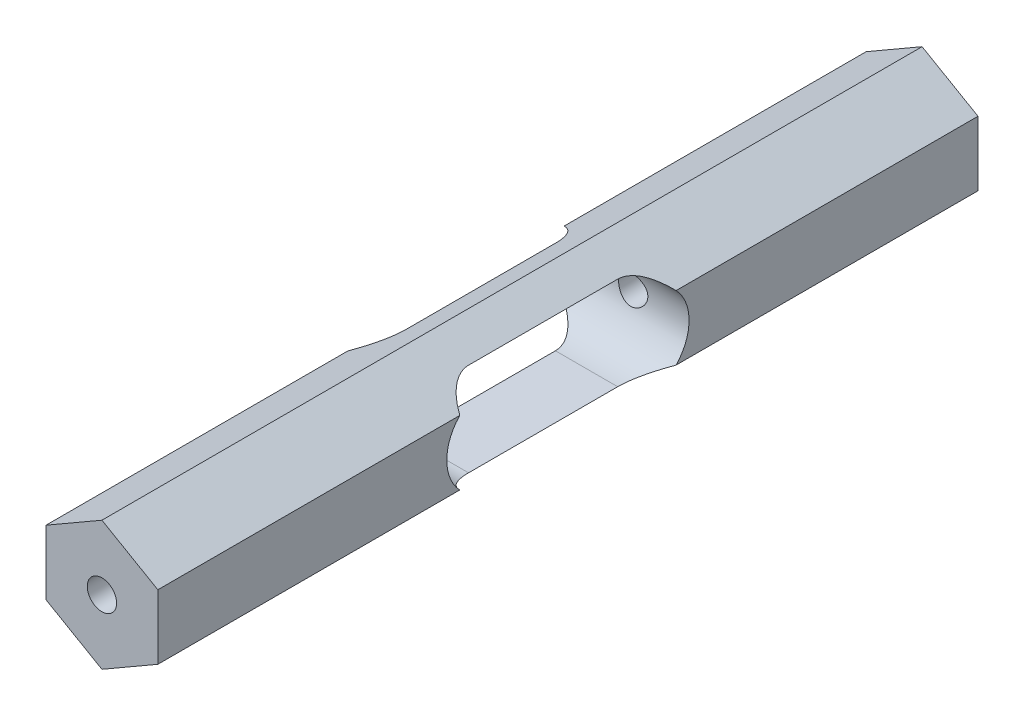
ISO-10303-21;
HEADER;
FILE_DESCRIPTION(('STEP AP214'),'2;1');
FILE_NAME('part.step','',(''),(''),'','','');
FILE_SCHEMA(('AUTOMOTIVE_DESIGN { 1 0 10303 214 1 1 1 1 }'));
ENDSEC;
DATA;
#1=APPLICATION_CONTEXT('core data for automotive mechanical design processes');
#2=APPLICATION_PROTOCOL_DEFINITION('international standard','automotive_design',2000,#1);
#3=PRODUCT_CONTEXT('',#1,'mechanical');
#4=PRODUCT('Part','Part','',(#3));
#5=PRODUCT_RELATED_PRODUCT_CATEGORY('part','',(#4));
#6=PRODUCT_DEFINITION_FORMATION('','',#4);
#7=PRODUCT_DEFINITION_CONTEXT('part definition',#1,'design');
#8=PRODUCT_DEFINITION('design','',#6,#7);
#9=PRODUCT_DEFINITION_SHAPE('','',#8);
#10=(LENGTH_UNIT() NAMED_UNIT(*) SI_UNIT(.MILLI.,.METRE.));
#11=(NAMED_UNIT(*) PLANE_ANGLE_UNIT() SI_UNIT($,.RADIAN.));
#12=(NAMED_UNIT(*) SI_UNIT($,.STERADIAN.) SOLID_ANGLE_UNIT());
#13=UNCERTAINTY_MEASURE_WITH_UNIT(LENGTH_MEASURE(1.E-05),#10,'distance_accuracy_value','');
#14=(GEOMETRIC_REPRESENTATION_CONTEXT(3) GLOBAL_UNCERTAINTY_ASSIGNED_CONTEXT((#13)) GLOBAL_UNIT_ASSIGNED_CONTEXT((#10,
#11,#12)) REPRESENTATION_CONTEXT('',''));
#15=CARTESIAN_POINT('',(0.,0.,0.));
#16=DIRECTION('',(0.,0.,1.));
#17=DIRECTION('',(1.,0.,0.));
#18=AXIS2_PLACEMENT_3D('',#15,#16,#17);
#19=CARTESIAN_POINT('',(-4.7625,2.74963065701559,34.925));
#20=DIRECTION('',(1.,0.,0.));
#21=DIRECTION('',(0.,1.,0.));
#22=AXIS2_PLACEMENT_3D('',#19,#20,#21);
#23=PLANE('',#22);
#24=DIRECTION('',(0.,0.,-1.));
#25=VECTOR('',#24,1.);
#26=CARTESIAN_POINT('',(-4.7625,2.74963065701559,34.925));
#27=LINE('',#26,#25);
#28=CARTESIAN_POINT('',(-4.7625,2.74963065701559,34.925));
#29=VERTEX_POINT('',#28);
#30=CARTESIAN_POINT('',(-4.7625,2.74963065701559,9.21190632489954));
#31=VERTEX_POINT('',#30);
#32=EDGE_CURVE('E229',#29,#31,#27,.T.);
#33=ORIENTED_EDGE('',*,*,#32,.T.);
#34=CARTESIAN_POINT('',(-4.7625,0.,6.35));
#35=DIRECTION('',(1.,0.,0.));
#36=DIRECTION('',(0.,0.,-1.));
#37=AXIS2_PLACEMENT_3D('',#34,#35,#36);
#38=CIRCLE('',#37,3.96875);
#39=CARTESIAN_POINT('',(-4.7625,-2.74963065701559,9.21190632489954));
#40=VERTEX_POINT('',#39);
#41=EDGE_CURVE('E256',#31,#40,#38,.T.);
#42=ORIENTED_EDGE('',*,*,#41,.T.);
#43=DIRECTION('',(0.,0.,-1.));
#44=VECTOR('',#43,1.);
#45=CARTESIAN_POINT('',(-4.7625,-2.74963065701559,34.925));
#46=LINE('',#45,#44);
#47=CARTESIAN_POINT('',(-4.7625,-2.74963065701559,34.925));
#48=VERTEX_POINT('',#47);
#49=EDGE_CURVE('E226',#48,#40,#46,.T.);
#50=ORIENTED_EDGE('',*,*,#49,.F.);
#51=DIRECTION('',(0.,-1.,0.));
#52=VECTOR('',#51,1.);
#53=CARTESIAN_POINT('',(-4.7625,2.74963065701559,34.925));
#54=LINE('',#53,#52);
#55=EDGE_CURVE('E192',#29,#48,#54,.T.);
#56=ORIENTED_EDGE('',*,*,#55,.F.);
#57=EDGE_LOOP('',(#33,#42,#50,#56));
#58=FACE_BOUND('',#57,.T.);
#59=ADVANCED_FACE('F37',(#58),#23,.F.);
#60=CARTESIAN_POINT('',(4.7625,-2.74963065701559,34.925));
#61=DIRECTION('',(-1.,0.,0.));
#62=DIRECTION('',(0.,-1.,0.));
#63=AXIS2_PLACEMENT_3D('',#60,#61,#62);
#64=PLANE('',#63);
#65=DIRECTION('',(0.,0.,-1.));
#66=VECTOR('',#65,1.);
#67=CARTESIAN_POINT('',(4.7625,-2.74963065701559,34.925));
#68=LINE('',#67,#66);
#69=CARTESIAN_POINT('',(4.7625,-2.74963065701559,34.925));
#70=VERTEX_POINT('',#69);
#71=CARTESIAN_POINT('',(4.7625,-2.74963065701559,9.21190632489954));
#72=VERTEX_POINT('',#71);
#73=EDGE_CURVE('E219',#70,#72,#68,.T.);
#74=ORIENTED_EDGE('',*,*,#73,.T.);
#75=CARTESIAN_POINT('',(4.7625,0.,6.35));
#76=DIRECTION('',(-1.,0.,0.));
#77=DIRECTION('',(0.,-1.,0.));
#78=AXIS2_PLACEMENT_3D('',#75,#76,#77);
#79=CIRCLE('',#78,3.96875);
#80=CARTESIAN_POINT('',(4.7625,2.74963065701559,9.21190632489954));
#81=VERTEX_POINT('',#80);
#82=EDGE_CURVE('E237',#72,#81,#79,.T.);
#83=ORIENTED_EDGE('',*,*,#82,.T.);
#84=DIRECTION('',(0.,0.,-1.));
#85=VECTOR('',#84,1.);
#86=CARTESIAN_POINT('',(4.7625,2.74963065701559,34.925));
#87=LINE('',#86,#85);
#88=CARTESIAN_POINT('',(4.7625,2.74963065701559,34.925));
#89=VERTEX_POINT('',#88);
#90=EDGE_CURVE('E215',#89,#81,#87,.T.);
#91=ORIENTED_EDGE('',*,*,#90,.F.);
#92=DIRECTION('',(0.,1.,0.));
#93=VECTOR('',#92,1.);
#94=CARTESIAN_POINT('',(4.7625,-2.74963065701559,34.925));
#95=LINE('',#94,#93);
#96=EDGE_CURVE('E198',#70,#89,#95,.T.);
#97=ORIENTED_EDGE('',*,*,#96,.F.);
#98=EDGE_LOOP('',(#74,#83,#91,#97));
#99=FACE_BOUND('',#98,.T.);
#100=ADVANCED_FACE('F289',(#99),#64,.F.);
#101=CARTESIAN_POINT('',(4.7625,2.74963065701559,34.925));
#102=DIRECTION('',(-0.5,-0.866025403784439,0.));
#103=DIRECTION('',(0.866025403784439,-0.5,0.));
#104=AXIS2_PLACEMENT_3D('',#101,#102,#103);
#105=PLANE('',#104);
#106=ORIENTED_EDGE('',*,*,#90,.T.);
#107=CARTESIAN_POINT('',(9.525,0.,6.35));
#108=DIRECTION('',(-0.5,-0.866025403784439,0.));
#109=DIRECTION('',(0.866025403784439,-0.5,0.));
#110=AXIS2_PLACEMENT_3D('',#107,#108,#109);
#111=ELLIPSE('',#110,7.9375,3.96875);
#112=CARTESIAN_POINT('',(2.65092335746101,3.96875,6.35));
#113=VERTEX_POINT('',#112);
#114=EDGE_CURVE('E177',#81,#113,#111,.T.);
#115=ORIENTED_EDGE('',*,*,#114,.T.);
#116=DIRECTION('',(0.,0.,-1.));
#117=VECTOR('',#116,1.);
#118=CARTESIAN_POINT('',(2.65092335746102,3.96875,34.925));
#119=LINE('',#118,#117);
#120=CARTESIAN_POINT('',(2.65092335746101,3.96875,-6.35));
#121=VERTEX_POINT('',#120);
#122=EDGE_CURVE('E183',#113,#121,#119,.T.);
#123=ORIENTED_EDGE('',*,*,#122,.T.);
#124=CARTESIAN_POINT('',(9.525,0.,-6.35));
#125=DIRECTION('',(-0.5,-0.866025403784439,0.));
#126=DIRECTION('',(0.866025403784439,-0.5,0.));
#127=AXIS2_PLACEMENT_3D('',#124,#125,#126);
#128=ELLIPSE('',#127,7.9375,3.96875);
#129=CARTESIAN_POINT('',(4.7625,2.74963065701559,-9.21190632489954));
#130=VERTEX_POINT('',#129);
#131=EDGE_CURVE('E156',#121,#130,#128,.T.);
#132=ORIENTED_EDGE('',*,*,#131,.T.);
#133=CARTESIAN_POINT('',(4.7625,2.74963065701559,-34.925));
#134=VERTEX_POINT('',#133);
#135=EDGE_CURVE('E200',#130,#134,#87,.T.);
#136=ORIENTED_EDGE('',*,*,#135,.T.);
#137=DIRECTION('',(-0.866025403784439,0.5,0.));
#138=VECTOR('',#137,1.);
#139=CARTESIAN_POINT('',(4.7625,2.74963065701559,-34.925));
#140=LINE('',#139,#138);
#141=CARTESIAN_POINT('',(0.,5.49926131403118,-34.925));
#142=VERTEX_POINT('',#141);
#143=EDGE_CURVE('E185',#134,#142,#140,.T.);
#144=ORIENTED_EDGE('',*,*,#143,.T.);
#145=DIRECTION('',(0.,0.,-1.));
#146=VECTOR('',#145,1.);
#147=CARTESIAN_POINT('',(0.,5.49926131403118,34.925));
#148=LINE('',#147,#146);
#149=CARTESIAN_POINT('',(0.,5.49926131403118,34.925));
#150=VERTEX_POINT('',#149);
#151=EDGE_CURVE('E232',#150,#142,#148,.T.);
#152=ORIENTED_EDGE('',*,*,#151,.F.);
#153=DIRECTION('',(-0.866025403784439,0.5,0.));
#154=VECTOR('',#153,1.);
#155=CARTESIAN_POINT('',(4.7625,2.74963065701559,34.925));
#156=LINE('',#155,#154);
#157=EDGE_CURVE('E186',#89,#150,#156,.T.);
#158=ORIENTED_EDGE('',*,*,#157,.F.);
#159=EDGE_LOOP('',(#106,#115,#123,#132,#136,#144,#152,#158));
#160=FACE_BOUND('',#159,.T.);
#161=ADVANCED_FACE('F39',(#160),#105,.F.);
#162=CARTESIAN_POINT('',(0.,5.49926131403118,34.925));
#163=DIRECTION('',(0.5,-0.866025403784439,0.));
#164=DIRECTION('',(0.866025403784439,0.5,0.));
#165=AXIS2_PLACEMENT_3D('',#162,#163,#164);
#166=PLANE('',#165);
#167=DIRECTION('',(0.,0.,1.));
#168=VECTOR('',#167,1.);
#169=CARTESIAN_POINT('',(-2.65092335746102,3.96875,34.925));
#170=LINE('',#169,#168);
#171=CARTESIAN_POINT('',(-2.65092335746102,3.96875,-6.35));
#172=VERTEX_POINT('',#171);
#173=CARTESIAN_POINT('',(-2.65092335746102,3.96875,6.35));
#174=VERTEX_POINT('',#173);
#175=EDGE_CURVE('E11',#172,#174,#170,.T.);
#176=ORIENTED_EDGE('',*,*,#175,.T.);
#177=CARTESIAN_POINT('',(-9.525,0.,6.35));
#178=DIRECTION('',(0.5,-0.866025403784439,0.));
#179=DIRECTION('',(0.866025403784439,0.5,0.));
#180=AXIS2_PLACEMENT_3D('',#177,#178,#179);
#181=ELLIPSE('',#180,7.9375,3.96875);
#182=EDGE_CURVE('E175',#174,#31,#181,.T.);
#183=ORIENTED_EDGE('',*,*,#182,.T.);
#184=ORIENTED_EDGE('',*,*,#32,.F.);
#185=DIRECTION('',(-0.866025403784439,-0.5,0.));
#186=VECTOR('',#185,1.);
#187=CARTESIAN_POINT('',(0.,5.49926131403118,34.925));
#188=LINE('',#187,#186);
#189=EDGE_CURVE('E189',#150,#29,#188,.T.);
#190=ORIENTED_EDGE('',*,*,#189,.F.);
#191=ORIENTED_EDGE('',*,*,#151,.T.);
#192=DIRECTION('',(-0.866025403784439,-0.5,0.));
#193=VECTOR('',#192,1.);
#194=CARTESIAN_POINT('',(0.,5.49926131403118,-34.925));
#195=LINE('',#194,#193);
#196=CARTESIAN_POINT('',(-4.7625,2.74963065701559,-34.925));
#197=VERTEX_POINT('',#196);
#198=EDGE_CURVE('E203',#142,#197,#195,.T.);
#199=ORIENTED_EDGE('',*,*,#198,.T.);
#200=CARTESIAN_POINT('',(-4.7625,2.74963065701559,-9.21190632489954));
#201=VERTEX_POINT('',#200);
#202=EDGE_CURVE('E161',#201,#197,#27,.T.);
#203=ORIENTED_EDGE('',*,*,#202,.F.);
#204=CARTESIAN_POINT('',(-9.525,0.,-6.35));
#205=DIRECTION('',(0.5,-0.866025403784439,0.));
#206=DIRECTION('',(0.866025403784439,0.5,0.));
#207=AXIS2_PLACEMENT_3D('',#204,#205,#206);
#208=ELLIPSE('',#207,7.9375,3.96875);
#209=EDGE_CURVE('E153',#201,#172,#208,.T.);
#210=ORIENTED_EDGE('',*,*,#209,.T.);
#211=EDGE_LOOP('',(#176,#183,#184,#190,#191,#199,#203,#210));
#212=FACE_BOUND('',#211,.T.);
#213=ADVANCED_FACE('F159',(#212),#166,.F.);
#214=CARTESIAN_POINT('',(-4.7625,-2.74963065701559,-9.21190632489954));
#215=VERTEX_POINT('',#214);
#216=CARTESIAN_POINT('',(-4.7625,-2.74963065701559,-34.925));
#217=VERTEX_POINT('',#216);
#218=EDGE_CURVE('E225',#215,#217,#46,.T.);
#219=ORIENTED_EDGE('',*,*,#218,.F.);
#220=CARTESIAN_POINT('',(-4.7625,0.,-6.35));
#221=DIRECTION('',(1.,0.,0.));
#222=DIRECTION('',(0.,0.,-1.));
#223=AXIS2_PLACEMENT_3D('',#220,#221,#222);
#224=CIRCLE('',#223,3.96875);
#225=EDGE_CURVE('E250',#215,#201,#224,.T.);
#226=ORIENTED_EDGE('',*,*,#225,.T.);
#227=ORIENTED_EDGE('',*,*,#202,.T.);
#228=DIRECTION('',(0.,-1.,0.));
#229=VECTOR('',#228,1.);
#230=CARTESIAN_POINT('',(-4.7625,2.74963065701559,-34.925));
#231=LINE('',#230,#229);
#232=EDGE_CURVE('E205',#197,#217,#231,.T.);
#233=ORIENTED_EDGE('',*,*,#232,.T.);
#234=EDGE_LOOP('',(#219,#226,#227,#233));
#235=FACE_BOUND('',#234,.T.);
#236=ADVANCED_FACE('F292',(#235),#23,.F.);
#237=CARTESIAN_POINT('',(-4.7625,-2.74963065701559,34.925));
#238=DIRECTION('',(0.5,0.866025403784439,0.));
#239=DIRECTION('',(-0.866025403784439,0.5,0.));
#240=AXIS2_PLACEMENT_3D('',#237,#238,#239);
#241=PLANE('',#240);
#242=ORIENTED_EDGE('',*,*,#49,.T.);
#243=CARTESIAN_POINT('',(-9.525,0.,6.35));
#244=DIRECTION('',(0.5,0.866025403784439,0.));
#245=DIRECTION('',(0.866025403784439,-0.5,0.));
#246=AXIS2_PLACEMENT_3D('',#243,#244,#245);
#247=ELLIPSE('',#246,7.93750000000001,3.96875);
#248=CARTESIAN_POINT('',(-2.65092335746102,-3.96875,6.35));
#249=VERTEX_POINT('',#248);
#250=EDGE_CURVE('E172',#40,#249,#247,.T.);
#251=ORIENTED_EDGE('',*,*,#250,.T.);
#252=DIRECTION('',(0.,0.,-1.));
#253=VECTOR('',#252,1.);
#254=CARTESIAN_POINT('',(-2.65092335746102,-3.96875,34.925));
#255=LINE('',#254,#253);
#256=CARTESIAN_POINT('',(-2.65092335746102,-3.96875,-6.34999999999999));
#257=VERTEX_POINT('',#256);
#258=EDGE_CURVE('E180',#249,#257,#255,.T.);
#259=ORIENTED_EDGE('',*,*,#258,.T.);
#260=CARTESIAN_POINT('',(-9.525,0.,-6.35));
#261=DIRECTION('',(0.5,0.866025403784439,0.));
#262=DIRECTION('',(0.866025403784439,-0.5,0.));
#263=AXIS2_PLACEMENT_3D('',#260,#261,#262);
#264=ELLIPSE('',#263,7.93750000000001,3.96875);
#265=EDGE_CURVE('E162',#257,#215,#264,.T.);
#266=ORIENTED_EDGE('',*,*,#265,.T.);
#267=ORIENTED_EDGE('',*,*,#218,.T.);
#268=DIRECTION('',(0.866025403784439,-0.5,0.));
#269=VECTOR('',#268,1.);
#270=CARTESIAN_POINT('',(-4.7625,-2.74963065701559,-34.925));
#271=LINE('',#270,#269);
#272=CARTESIAN_POINT('',(0.,-5.49926131403119,-34.925));
#273=VERTEX_POINT('',#272);
#274=EDGE_CURVE('E208',#217,#273,#271,.T.);
#275=ORIENTED_EDGE('',*,*,#274,.T.);
#276=DIRECTION('',(0.,0.,-1.));
#277=VECTOR('',#276,1.);
#278=CARTESIAN_POINT('',(0.,-5.49926131403119,34.925));
#279=LINE('',#278,#277);
#280=CARTESIAN_POINT('',(0.,-5.49926131403119,34.925));
#281=VERTEX_POINT('',#280);
#282=EDGE_CURVE('E222',#281,#273,#279,.T.);
#283=ORIENTED_EDGE('',*,*,#282,.F.);
#284=DIRECTION('',(0.866025403784439,-0.5,0.));
#285=VECTOR('',#284,1.);
#286=CARTESIAN_POINT('',(-4.7625,-2.74963065701559,34.925));
#287=LINE('',#286,#285);
#288=EDGE_CURVE('E194',#48,#281,#287,.T.);
#289=ORIENTED_EDGE('',*,*,#288,.F.);
#290=EDGE_LOOP('',(#242,#251,#259,#266,#267,#275,#283,#289));
#291=FACE_BOUND('',#290,.T.);
#292=ADVANCED_FACE('F301',(#291),#241,.F.);
#293=CARTESIAN_POINT('',(0.,-5.49926131403119,34.925));
#294=DIRECTION('',(-0.5,0.866025403784439,0.));
#295=DIRECTION('',(-0.866025403784438,-0.5,0.));
#296=AXIS2_PLACEMENT_3D('',#293,#294,#295);
#297=PLANE('',#296);
#298=DIRECTION('',(0.,0.,1.));
#299=VECTOR('',#298,1.);
#300=CARTESIAN_POINT('',(2.65092335746102,-3.96875,34.925));
#301=LINE('',#300,#299);
#302=CARTESIAN_POINT('',(2.65092335746102,-3.96875,-6.35));
#303=VERTEX_POINT('',#302);
#304=CARTESIAN_POINT('',(2.65092335746102,-3.96875,6.35));
#305=VERTEX_POINT('',#304);
#306=EDGE_CURVE('E50',#303,#305,#301,.T.);
#307=ORIENTED_EDGE('',*,*,#306,.T.);
#308=CARTESIAN_POINT('',(9.525,0.,6.35));
#309=DIRECTION('',(-0.5,0.866025403784439,0.));
#310=DIRECTION('',(0.866025403784438,0.5,0.));
#311=AXIS2_PLACEMENT_3D('',#308,#309,#310);
#312=ELLIPSE('',#311,7.9375,3.96875);
#313=EDGE_CURVE('E164',#305,#72,#312,.T.);
#314=ORIENTED_EDGE('',*,*,#313,.T.);
#315=ORIENTED_EDGE('',*,*,#73,.F.);
#316=DIRECTION('',(0.866025403784439,0.5,0.));
#317=VECTOR('',#316,1.);
#318=CARTESIAN_POINT('',(0.,-5.49926131403119,34.925));
#319=LINE('',#318,#317);
#320=EDGE_CURVE('E196',#281,#70,#319,.T.);
#321=ORIENTED_EDGE('',*,*,#320,.F.);
#322=ORIENTED_EDGE('',*,*,#282,.T.);
#323=DIRECTION('',(0.866025403784439,0.5,0.));
#324=VECTOR('',#323,1.);
#325=CARTESIAN_POINT('',(0.,-5.49926131403119,-34.925));
#326=LINE('',#325,#324);
#327=CARTESIAN_POINT('',(4.7625,-2.74963065701559,-34.925));
#328=VERTEX_POINT('',#327);
#329=EDGE_CURVE('E210',#273,#328,#326,.T.);
#330=ORIENTED_EDGE('',*,*,#329,.T.);
#331=CARTESIAN_POINT('',(4.7625,-2.74963065701559,-9.21190632489954));
#332=VERTEX_POINT('',#331);
#333=EDGE_CURVE('E218',#332,#328,#68,.T.);
#334=ORIENTED_EDGE('',*,*,#333,.F.);
#335=CARTESIAN_POINT('',(9.525,0.,-6.35));
#336=DIRECTION('',(-0.5,0.866025403784439,0.));
#337=DIRECTION('',(0.866025403784438,0.5,0.));
#338=AXIS2_PLACEMENT_3D('',#335,#336,#337);
#339=ELLIPSE('',#338,7.9375,3.96875);
#340=EDGE_CURVE('E64',#332,#303,#339,.T.);
#341=ORIENTED_EDGE('',*,*,#340,.T.);
#342=EDGE_LOOP('',(#307,#314,#315,#321,#322,#330,#334,#341));
#343=FACE_BOUND('',#342,.T.);
#344=ADVANCED_FACE('F242',(#343),#297,.F.);
#345=ORIENTED_EDGE('',*,*,#135,.F.);
#346=CARTESIAN_POINT('',(4.7625,0.,-6.35));
#347=DIRECTION('',(-1.,0.,0.));
#348=DIRECTION('',(0.,-1.,0.));
#349=AXIS2_PLACEMENT_3D('',#346,#347,#348);
#350=CIRCLE('',#349,3.96875);
#351=EDGE_CURVE('E235',#130,#332,#350,.T.);
#352=ORIENTED_EDGE('',*,*,#351,.T.);
#353=ORIENTED_EDGE('',*,*,#333,.T.);
#354=DIRECTION('',(0.,1.,0.));
#355=VECTOR('',#354,1.);
#356=CARTESIAN_POINT('',(4.7625,-2.74963065701559,-34.925));
#357=LINE('',#356,#355);
#358=EDGE_CURVE('E190',#328,#134,#357,.T.);
#359=ORIENTED_EDGE('',*,*,#358,.T.);
#360=EDGE_LOOP('',(#345,#352,#353,#359));
#361=FACE_BOUND('',#360,.T.);
#362=ADVANCED_FACE('F298',(#361),#64,.F.);
#363=CARTESIAN_POINT('',(0.,0.,34.925));
#364=DIRECTION('',(0.,0.,1.));
#365=DIRECTION('',(1.,0.,0.));
#366=AXIS2_PLACEMENT_3D('',#363,#364,#365);
#367=PLANE('',#366);
#368=CARTESIAN_POINT('',(0.,0.,34.925));
#369=DIRECTION('',(0.,0.,1.));
#370=DIRECTION('',(1.,0.,0.));
#371=AXIS2_PLACEMENT_3D('',#368,#369,#370);
#372=CIRCLE('',#371,1.25);
#373=CARTESIAN_POINT('',(1.25,0.,34.925));
#374=VERTEX_POINT('',#373);
#375=EDGE_CURVE('E343',#374,#374,#372,.T.);
#376=ORIENTED_EDGE('',*,*,#375,.F.);
#377=EDGE_LOOP('',(#376));
#378=FACE_BOUND('',#377,.T.);
#379=ORIENTED_EDGE('',*,*,#157,.T.);
#380=ORIENTED_EDGE('',*,*,#189,.T.);
#381=ORIENTED_EDGE('',*,*,#55,.T.);
#382=ORIENTED_EDGE('',*,*,#288,.T.);
#383=ORIENTED_EDGE('',*,*,#320,.T.);
#384=ORIENTED_EDGE('',*,*,#96,.T.);
#385=EDGE_LOOP('',(#379,#380,#381,#382,#383,#384));
#386=FACE_BOUND('',#385,.T.);
#387=ADVANCED_FACE('F318',(#378,#386),#367,.T.);
#388=CARTESIAN_POINT('',(0.,0.,-34.925));
#389=DIRECTION('',(0.,0.,1.));
#390=DIRECTION('',(1.,0.,0.));
#391=AXIS2_PLACEMENT_3D('',#388,#389,#390);
#392=PLANE('',#391);
#393=CARTESIAN_POINT('',(0.,0.,-34.925));
#394=DIRECTION('',(0.,0.,1.));
#395=DIRECTION('',(1.,0.,0.));
#396=AXIS2_PLACEMENT_3D('',#393,#394,#395);
#397=CIRCLE('',#396,1.25);
#398=CARTESIAN_POINT('',(1.25,0.,-34.925));
#399=VERTEX_POINT('',#398);
#400=EDGE_CURVE('E265',#399,#399,#397,.T.);
#401=ORIENTED_EDGE('',*,*,#400,.T.);
#402=EDGE_LOOP('',(#401));
#403=FACE_BOUND('',#402,.T.);
#404=ORIENTED_EDGE('',*,*,#143,.F.);
#405=ORIENTED_EDGE('',*,*,#358,.F.);
#406=ORIENTED_EDGE('',*,*,#329,.F.);
#407=ORIENTED_EDGE('',*,*,#274,.F.);
#408=ORIENTED_EDGE('',*,*,#232,.F.);
#409=ORIENTED_EDGE('',*,*,#198,.F.);
#410=EDGE_LOOP('',(#404,#405,#406,#407,#408,#409));
#411=FACE_BOUND('',#410,.T.);
#412=ADVANCED_FACE('F279',(#403,#411),#392,.F.);
#413=CARTESIAN_POINT('',(-4.7625,3.96875,6.35));
#414=DIRECTION('',(0.,1.,0.));
#415=DIRECTION('',(0.,0.,1.));
#416=AXIS2_PLACEMENT_3D('',#413,#414,#415);
#417=PLANE('',#416);
#418=DIRECTION('',(1.,0.,0.));
#419=VECTOR('',#418,1.);
#420=CARTESIAN_POINT('',(-4.7625,3.96875,6.35));
#421=LINE('',#420,#419);
#422=EDGE_CURVE('E148',#174,#113,#421,.T.);
#423=ORIENTED_EDGE('',*,*,#422,.F.);
#424=ORIENTED_EDGE('',*,*,#175,.F.);
#425=DIRECTION('',(1.,0.,0.));
#426=VECTOR('',#425,1.);
#427=CARTESIAN_POINT('',(-4.7625,3.96875,-6.35));
#428=LINE('',#427,#426);
#429=EDGE_CURVE('E145',#172,#121,#428,.T.);
#430=ORIENTED_EDGE('',*,*,#429,.T.);
#431=ORIENTED_EDGE('',*,*,#122,.F.);
#432=EDGE_LOOP('',(#423,#424,#430,#431));
#433=FACE_BOUND('',#432,.T.);
#434=ADVANCED_FACE('F144',(#433),#417,.F.);
#435=CARTESIAN_POINT('',(-4.7625,-3.96875,6.35));
#436=DIRECTION('',(0.,-1.,0.));
#437=DIRECTION('',(0.,0.,-1.));
#438=AXIS2_PLACEMENT_3D('',#435,#436,#437);
#439=PLANE('',#438);
#440=DIRECTION('',(1.,0.,0.));
#441=VECTOR('',#440,1.);
#442=CARTESIAN_POINT('',(-4.7625,-3.96875,6.35));
#443=LINE('',#442,#441);
#444=EDGE_CURVE('E248',#249,#305,#443,.T.);
#445=ORIENTED_EDGE('',*,*,#444,.T.);
#446=ORIENTED_EDGE('',*,*,#306,.F.);
#447=DIRECTION('',(1.,0.,0.));
#448=VECTOR('',#447,1.);
#449=CARTESIAN_POINT('',(-4.7625,-3.96875,-6.35));
#450=LINE('',#449,#448);
#451=EDGE_CURVE('E57',#257,#303,#450,.T.);
#452=ORIENTED_EDGE('',*,*,#451,.F.);
#453=ORIENTED_EDGE('',*,*,#258,.F.);
#454=EDGE_LOOP('',(#445,#446,#452,#453));
#455=FACE_BOUND('',#454,.T.);
#456=ADVANCED_FACE('F246',(#455),#439,.F.);
#457=CARTESIAN_POINT('',(-4.7625,0.,6.35));
#458=DIRECTION('',(1.,0.,0.));
#459=DIRECTION('',(0.,0.,-1.));
#460=AXIS2_PLACEMENT_3D('',#457,#458,#459);
#461=CYLINDRICAL_SURFACE('',#460,3.96875);
#462=CARTESIAN_POINT('',(1.25,0.,10.31875));
#463=CARTESIAN_POINT('',(1.24999963528157,0.068412114089317,10.3187497136087));
#464=CARTESIAN_POINT('',(1.24436525806151,0.136828156224988,10.3169644457573));
#465=CARTESIAN_POINT('',(1.22203682344294,0.271657796118097,10.3100176709775));
#466=CARTESIAN_POINT('',(1.20534042104088,0.338070966171364,10.3048554481822));
#467=CARTESIAN_POINT('',(1.16150802454438,0.466931172286127,10.2917183534825));
#468=CARTESIAN_POINT('',(1.1343883401755,0.529384227920965,10.2837478773791));
#469=CARTESIAN_POINT('',(1.07054909982687,0.648856361456714,10.2658161465355));
#470=CARTESIAN_POINT('',(1.03382798526836,0.705874555076207,10.2558545686462));
#471=CARTESIAN_POINT('',(0.950617899246471,0.814644487616853,10.2346480237382));
#472=CARTESIAN_POINT('',(0.903882483527427,0.866202156840762,10.2233747689217));
#473=CARTESIAN_POINT('',(0.802495079729388,0.960892698960455,10.2009783198415));
#474=CARTESIAN_POINT('',(0.747841591621091,1.00402397188399,10.1898551544486));
#475=CARTESIAN_POINT('',(0.630481691398954,1.08169602130492,10.168713876476));
#476=CARTESIAN_POINT('',(0.567607201732345,1.11599322975997,10.1587306280692));
#477=CARTESIAN_POINT('',(0.436617508372472,1.17344616307896,10.1414255230202));
#478=CARTESIAN_POINT('',(0.368503715725454,1.19660487565492,10.1341029528254));
#479=CARTESIAN_POINT('',(0.23116089528452,1.23041123278229,10.1232444102237));
#480=CARTESIAN_POINT('',(0.162029429115569,1.2414193090009,10.1195996417969));
#481=CARTESIAN_POINT('',(0.0228121489987431,1.2517380451414,10.1161864921113));
#482=CARTESIAN_POINT('',(-0.0472734014860642,1.25105187139883,10.1164170615658));
#483=CARTESIAN_POINT('',(-0.183417476589357,1.23828325381029,10.1206325822188));
#484=CARTESIAN_POINT('',(-0.249524582038242,1.22666036586433,10.1244661302334));
#485=CARTESIAN_POINT('',(-0.378798083928467,1.19309388358606,10.1352094998696));
#486=CARTESIAN_POINT('',(-0.441964162519938,1.171149176561,10.1421196531452));
#487=CARTESIAN_POINT('',(-0.564651456757722,1.11724021299722,10.1583527197106));
#488=CARTESIAN_POINT('',(-0.624104966257967,1.08513259918302,10.1677097987216));
#489=CARTESIAN_POINT('',(-0.736930450938381,1.011908791549,10.1877669110845));
#490=CARTESIAN_POINT('',(-0.790300819803432,0.97079022663476,10.1984672975901));
#491=CARTESIAN_POINT('',(-0.892041327016286,0.878462175340962,10.2206114024654));
#492=CARTESIAN_POINT('',(-0.940065701827312,0.826873723779801,10.2320666026867));
#493=CARTESIAN_POINT('',(-1.02686629750491,0.716233048295347,10.253993231372));
#494=CARTESIAN_POINT('',(-1.06564181140364,0.657180254337402,10.2644645845954));
#495=CARTESIAN_POINT('',(-1.13308325586222,0.532613158922486,10.2833566448328));
#496=CARTESIAN_POINT('',(-1.16166555091195,0.467050802313447,10.2917602192018));
#497=CARTESIAN_POINT('',(-1.20729240868508,0.331722124106925,10.3054461265975));
#498=CARTESIAN_POINT('',(-1.22434053248131,0.261957107294461,10.3107294229181));
#499=CARTESIAN_POINT('',(-1.24582341738829,0.123137511147098,10.3174239556787));
#500=CARTESIAN_POINT('',(-1.250726155726,0.0541621725752543,10.3189787756234));
#501=CARTESIAN_POINT('',(-1.24910012409593,-0.0836337039762736,10.3184665110844));
#502=CARTESIAN_POINT('',(-1.24257305341004,-0.152454263444064,10.316399964993));
#503=CARTESIAN_POINT('',(-1.21864778841324,-0.286174148617994,10.308971574809));
#504=CARTESIAN_POINT('',(-1.20152906454445,-0.351128640068622,10.3036945013532));
#505=CARTESIAN_POINT('',(-1.15724840522914,-0.477224454035149,10.2904639340311));
#506=CARTESIAN_POINT('',(-1.13008522367556,-0.538365302333325,10.2825101081002));
#507=CARTESIAN_POINT('',(-1.06573984518492,-0.656772757537706,10.2644991019092));
#508=CARTESIAN_POINT('',(-1.02832746762404,-0.713906938459039,10.2543949627131));
#509=CARTESIAN_POINT('',(-0.944821176059071,-0.821242706132605,10.2332376571391));
#510=CARTESIAN_POINT('',(-0.898724872284957,-0.871442377938119,10.222184229979));
#511=CARTESIAN_POINT('',(-0.796957935519564,-0.965584351663613,10.1998131127587));
#512=CARTESIAN_POINT('',(-0.740976367343281,-1.00919303321544,10.1885027197735));
#513=CARTESIAN_POINT('',(-0.62224432301136,-1.08642843771261,10.1673628028881));
#514=CARTESIAN_POINT('',(-0.559493938251589,-1.12005529541442,10.1575332589971));
#515=CARTESIAN_POINT('',(-0.42911923479155,-1.17616857842768,10.1405758572546));
#516=CARTESIAN_POINT('',(-0.361513980553368,-1.19869611344943,10.1334380531405));
#517=CARTESIAN_POINT('',(-0.223198148095662,-1.23196464648793,10.1227378656284));
#518=CARTESIAN_POINT('',(-0.15248878687028,-1.24271022156044,10.1191740938363));
#519=CARTESIAN_POINT('',(-0.0134640313667039,-1.25177774606669,10.1161716995369));
#520=CARTESIAN_POINT('',(0.0548121265316478,-1.25064771466447,10.116551103511));
#521=CARTESIAN_POINT('',(0.190150382834516,-1.23732201366203,10.1209493382118));
#522=CARTESIAN_POINT('',(0.257212539405857,-1.22512687566661,10.1249679940968));
#523=CARTESIAN_POINT('',(0.387222149840162,-1.19038650839692,10.1360637854787));
#524=CARTESIAN_POINT('',(0.450216467539394,-1.16800046243757,10.1430937871298));
#525=CARTESIAN_POINT('',(0.57160509773334,-1.11363944992036,10.1594074829728));
#526=CARTESIAN_POINT('',(0.629998460854561,-1.08166251086027,10.1686916406887));
#527=CARTESIAN_POINT('',(0.743034584700202,-1.00754479231097,10.1889268529969));
#528=CARTESIAN_POINT('',(0.797436794723355,-0.965051253815965,10.1999294084139));
#529=CARTESIAN_POINT('',(0.898515725468427,-0.871724467434756,10.2221273900024));
#530=CARTESIAN_POINT('',(0.945190359944011,-0.82088897478748,10.2333228673602));
#531=CARTESIAN_POINT('',(1.03104911823916,-0.710281393173554,10.25509331561));
#532=CARTESIAN_POINT('',(1.06993143198722,-0.650267762575212,10.2656351292784));
#533=CARTESIAN_POINT('',(1.13700492558636,-0.52422443270294,10.2844906239905));
#534=CARTESIAN_POINT('',(1.16520014413301,-0.458197017785025,10.2928051463874));
#535=CARTESIAN_POINT('',(1.20814925689167,-0.327452552868721,10.3057194409724));
#536=CARTESIAN_POINT('',(1.22379751422886,-0.263052738101506,10.3105630484825));
#537=CARTESIAN_POINT('',(1.24472197304964,-0.132436252625908,10.317078133475));
#538=CARTESIAN_POINT('',(1.25000035303166,-0.0662199664852971,10.3187502772144));
#539=CARTESIAN_POINT('',(1.25,0.,10.31875));
#540=B_SPLINE_CURVE_WITH_KNOTS('',3,(#462,#463,#464,#465,#466,#467,#468,#469,#470,#471,#472,
#473,#474,#475,#476,#477,#478,#479,#480,#481,#482,#483,#484,#485,#486,#487,#488,#489,#490,#491,
#492,#493,#494,#495,#496,#497,#498,#499,#500,#501,#502,#503,#504,#505,#506,#507,#508,#509,#510,
#511,#512,#513,#514,#515,#516,#517,#518,#519,#520,#521,#522,#523,#524,#525,#526,#527,#528,#529,
#530,#531,#532,#533,#534,#535,#536,#537,#538,#539),.UNSPECIFIED.,.T.,.F.,(4,2,2,2,2,2,2,2,2,2,2,
2,2,2,2,2,2,2,2,2,2,2,2,2,2,2,2,2,2,2,2,2,2,2,2,2,2,2,4),(0.,0.204992906598754,
0.410029282901838,0.614746128233172,0.819496225447137,1.03002540462275,1.24059451951382,
1.45646405699422,1.67227565880633,1.88149747145039,2.09066263608928,2.29141357175953,
2.49218615335482,2.69592748465548,2.89972249189241,3.11294999647506,3.32619379460082,
3.54114905177464,3.75603791310184,3.96250827141214,4.16894793616014,4.37016001283195,
4.57139706008573,4.77758803669272,4.98383583906265,5.19839381794895,5.41294890013118,
5.62670322401882,5.84037447917365,6.04423049591065,6.24807671923973,6.44884265234581,
6.64964990413921,6.85842006900727,7.0672465048576,7.28303905428059,7.49874997334696,
7.69721593569403,7.89564019995475),.UNSPECIFIED.);
#541=CARTESIAN_POINT('',(1.25,0.,10.31875));
#542=VERTEX_POINT('',#541);
#543=EDGE_CURVE('E259',#542,#542,#540,.T.);
#544=ORIENTED_EDGE('',*,*,#543,.T.);
#545=EDGE_LOOP('',(#544));
#546=FACE_BOUND('',#545,.T.);
#547=ORIENTED_EDGE('',*,*,#82,.F.);
#548=ORIENTED_EDGE('',*,*,#313,.F.);
#549=ORIENTED_EDGE('',*,*,#444,.F.);
#550=ORIENTED_EDGE('',*,*,#250,.F.);
#551=ORIENTED_EDGE('',*,*,#41,.F.);
#552=ORIENTED_EDGE('',*,*,#182,.F.);
#553=ORIENTED_EDGE('',*,*,#422,.T.);
#554=ORIENTED_EDGE('',*,*,#114,.F.);
#555=EDGE_LOOP('',(#547,#548,#549,#550,#551,#552,#553,#554));
#556=FACE_BOUND('',#555,.T.);
#557=ADVANCED_FACE('F267',(#546,#556),#461,.F.);
#558=CARTESIAN_POINT('',(-4.7625,0.,-6.35));
#559=DIRECTION('',(1.,0.,0.));
#560=DIRECTION('',(0.,0.,-1.));
#561=AXIS2_PLACEMENT_3D('',#558,#559,#560);
#562=CYLINDRICAL_SURFACE('',#561,3.96875);
#563=CARTESIAN_POINT('',(1.25,0.,-10.31875));
#564=CARTESIAN_POINT('',(1.24999963528157,-0.0684121140893172,-10.3187497136087));
#565=CARTESIAN_POINT('',(1.24436525806151,-0.136828156224989,-10.3169644457573));
#566=CARTESIAN_POINT('',(1.22203682344294,-0.271657796118097,-10.3100176709775));
#567=CARTESIAN_POINT('',(1.20534042104088,-0.338070966171364,-10.3048554481822));
#568=CARTESIAN_POINT('',(1.16150802454438,-0.466931172286127,-10.2917183534825));
#569=CARTESIAN_POINT('',(1.1343883401755,-0.529384227920965,-10.2837478773791));
#570=CARTESIAN_POINT('',(1.07054909982687,-0.648856361456714,-10.2658161465355));
#571=CARTESIAN_POINT('',(1.03382798526836,-0.705874555076207,-10.2558545686462));
#572=CARTESIAN_POINT('',(0.950617899246471,-0.814644487616854,-10.2346480237382));
#573=CARTESIAN_POINT('',(0.903882483527427,-0.866202156840763,-10.2233747689217));
#574=CARTESIAN_POINT('',(0.802495079729387,-0.960892698960455,-10.2009783198415));
#575=CARTESIAN_POINT('',(0.74784159162109,-1.00402397188399,-10.1898551544486));
#576=CARTESIAN_POINT('',(0.630481691398954,-1.08169602130492,-10.168713876476));
#577=CARTESIAN_POINT('',(0.567607201732345,-1.11599322975997,-10.1587306280692));
#578=CARTESIAN_POINT('',(0.436617508372471,-1.17344616307896,-10.1414255230202));
#579=CARTESIAN_POINT('',(0.368503715725454,-1.19660487565492,-10.1341029528254));
#580=CARTESIAN_POINT('',(0.23116089528452,-1.23041123278229,-10.1232444102237));
#581=CARTESIAN_POINT('',(0.162029429115569,-1.2414193090009,-10.1195996417969));
#582=CARTESIAN_POINT('',(0.0228121489987426,-1.2517380451414,-10.1161864921113));
#583=CARTESIAN_POINT('',(-0.0472734014860647,-1.25105187139883,-10.1164170615658));
#584=CARTESIAN_POINT('',(-0.183417476589357,-1.23828325381029,-10.1206325822188));
#585=CARTESIAN_POINT('',(-0.249524582038243,-1.22666036586433,-10.1244661302334));
#586=CARTESIAN_POINT('',(-0.378798083928468,-1.19309388358606,-10.1352094998696));
#587=CARTESIAN_POINT('',(-0.441964162519938,-1.171149176561,-10.1421196531452));
#588=CARTESIAN_POINT('',(-0.564651456757723,-1.11724021299722,-10.1583527197106));
#589=CARTESIAN_POINT('',(-0.624104966257967,-1.08513259918302,-10.1677097987216));
#590=CARTESIAN_POINT('',(-0.736930450938381,-1.011908791549,-10.1877669110845));
#591=CARTESIAN_POINT('',(-0.790300819803433,-0.97079022663476,-10.1984672975901));
#592=CARTESIAN_POINT('',(-0.892041327016286,-0.878462175340961,-10.2206114024654));
#593=CARTESIAN_POINT('',(-0.940065701827312,-0.826873723779801,-10.2320666026867));
#594=CARTESIAN_POINT('',(-1.02686629750491,-0.716233048295347,-10.2539932313721));
#595=CARTESIAN_POINT('',(-1.06564181140364,-0.657180254337402,-10.2644645845954));
#596=CARTESIAN_POINT('',(-1.13308325586222,-0.532613158922485,-10.2833566448328));
#597=CARTESIAN_POINT('',(-1.16166555091195,-0.467050802313446,-10.2917602192018));
#598=CARTESIAN_POINT('',(-1.20729240868508,-0.331722124106924,-10.3054461265975));
#599=CARTESIAN_POINT('',(-1.22434053248131,-0.26195710729446,-10.3107294229181));
#600=CARTESIAN_POINT('',(-1.24582341738829,-0.123137511147097,-10.3174239556787));
#601=CARTESIAN_POINT('',(-1.250726155726,-0.0541621725752532,-10.3189787756234));
#602=CARTESIAN_POINT('',(-1.24910012409593,0.0836337039762746,-10.3184665110844));
#603=CARTESIAN_POINT('',(-1.24257305341004,0.152454263444065,-10.316399964993));
#604=CARTESIAN_POINT('',(-1.21864778841324,0.286174148617995,-10.308971574809));
#605=CARTESIAN_POINT('',(-1.20152906454445,0.351128640068622,-10.3036945013532));
#606=CARTESIAN_POINT('',(-1.15724840522914,0.477224454035149,-10.2904639340311));
#607=CARTESIAN_POINT('',(-1.13008522367556,0.538365302333325,-10.2825101081002));
#608=CARTESIAN_POINT('',(-1.06573984518492,0.656772757537706,-10.2644991019092));
#609=CARTESIAN_POINT('',(-1.02832746762404,0.71390693845904,-10.2543949627131));
#610=CARTESIAN_POINT('',(-0.944821176059071,0.821242706132606,-10.2332376571391));
#611=CARTESIAN_POINT('',(-0.898724872284957,0.871442377938119,-10.222184229979));
#612=CARTESIAN_POINT('',(-0.796957935519563,0.965584351663613,-10.1998131127587));
#613=CARTESIAN_POINT('',(-0.74097636734328,1.00919303321544,-10.1885027197735));
#614=CARTESIAN_POINT('',(-0.622244323011359,1.08642843771261,-10.1673628028881));
#615=CARTESIAN_POINT('',(-0.559493938251589,1.12005529541442,-10.1575332589971));
#616=CARTESIAN_POINT('',(-0.429119234791551,1.17616857842768,-10.1405758572546));
#617=CARTESIAN_POINT('',(-0.361513980553369,1.19869611344943,-10.1334380531405));
#618=CARTESIAN_POINT('',(-0.223198148095662,1.23196464648793,-10.1227378656284));
#619=CARTESIAN_POINT('',(-0.15248878687028,1.24271022156044,-10.1191740938363));
#620=CARTESIAN_POINT('',(-0.0134640313667042,1.25177774606669,-10.1161716995369));
#621=CARTESIAN_POINT('',(0.0548121265316475,1.25064771466447,-10.116551103511));
#622=CARTESIAN_POINT('',(0.190150382834516,1.23732201366203,-10.1209493382118));
#623=CARTESIAN_POINT('',(0.257212539405857,1.22512687566661,-10.1249679940968));
#624=CARTESIAN_POINT('',(0.387222149840162,1.19038650839692,-10.1360637854787));
#625=CARTESIAN_POINT('',(0.450216467539394,1.16800046243757,-10.1430937871298));
#626=CARTESIAN_POINT('',(0.57160509773334,1.11363944992036,-10.1594074829728));
#627=CARTESIAN_POINT('',(0.629998460854561,1.08166251086027,-10.1686916406887));
#628=CARTESIAN_POINT('',(0.743034584700202,1.00754479231097,-10.1889268529969));
#629=CARTESIAN_POINT('',(0.797436794723355,0.965051253815965,-10.1999294084139));
#630=CARTESIAN_POINT('',(0.898515725468427,0.871724467434756,-10.2221273900024));
#631=CARTESIAN_POINT('',(0.945190359944011,0.82088897478748,-10.2333228673602));
#632=CARTESIAN_POINT('',(1.03104911823916,0.710281393173554,-10.25509331561));
#633=CARTESIAN_POINT('',(1.06993143198722,0.650267762575213,-10.2656351292784));
#634=CARTESIAN_POINT('',(1.13700492558636,0.524224432702941,-10.2844906239905));
#635=CARTESIAN_POINT('',(1.16520014413301,0.458197017785025,-10.2928051463874));
#636=CARTESIAN_POINT('',(1.20814925689167,0.327452552868721,-10.3057194409724));
#637=CARTESIAN_POINT('',(1.22379751422886,0.263052738101507,-10.3105630484825));
#638=CARTESIAN_POINT('',(1.24472197304964,0.132436252625909,-10.317078133475));
#639=CARTESIAN_POINT('',(1.25000035303166,0.0662199664852972,-10.3187502772144));
#640=CARTESIAN_POINT('',(1.25,0.,-10.31875));
#641=B_SPLINE_CURVE_WITH_KNOTS('',3,(#563,#564,#565,#566,#567,#568,#569,#570,#571,#572,#573,
#574,#575,#576,#577,#578,#579,#580,#581,#582,#583,#584,#585,#586,#587,#588,#589,#590,#591,#592,
#593,#594,#595,#596,#597,#598,#599,#600,#601,#602,#603,#604,#605,#606,#607,#608,#609,#610,#611,
#612,#613,#614,#615,#616,#617,#618,#619,#620,#621,#622,#623,#624,#625,#626,#627,#628,#629,#630,
#631,#632,#633,#634,#635,#636,#637,#638,#639,#640),.UNSPECIFIED.,.T.,.F.,(4,2,2,2,2,2,2,2,2,2,2,
2,2,2,2,2,2,2,2,2,2,2,2,2,2,2,2,2,2,2,2,2,2,2,2,2,2,2,4),(0.,0.204992906598754,
0.410029282901838,0.614746128233172,0.819496225447137,1.03002540462275,1.24059451951382,
1.45646405699422,1.67227565880633,1.88149747145039,2.09066263608928,2.29141357175953,
2.49218615335482,2.69592748465547,2.89972249189241,3.11294999647506,3.32619379460082,
3.54114905177464,3.75603791310184,3.96250827141215,4.16894793616014,4.37016001283195,
4.57139706008573,4.77758803669272,4.98383583906265,5.19839381794895,5.41294890013118,
5.62670322401882,5.84037447917365,6.04423049591065,6.24807671923972,6.4488426523458,
6.64964990413921,6.85842006900726,7.0672465048576,7.28303905428059,7.49874997334696,
7.69721593569402,7.89564019995474),.UNSPECIFIED.);
#642=CARTESIAN_POINT('',(1.25,0.,-10.31875));
#643=VERTEX_POINT('',#642);
#644=EDGE_CURVE('E41',#643,#643,#641,.T.);
#645=ORIENTED_EDGE('',*,*,#644,.T.);
#646=EDGE_LOOP('',(#645));
#647=FACE_BOUND('',#646,.T.);
#648=ORIENTED_EDGE('',*,*,#429,.F.);
#649=ORIENTED_EDGE('',*,*,#209,.F.);
#650=ORIENTED_EDGE('',*,*,#225,.F.);
#651=ORIENTED_EDGE('',*,*,#265,.F.);
#652=ORIENTED_EDGE('',*,*,#451,.T.);
#653=ORIENTED_EDGE('',*,*,#340,.F.);
#654=ORIENTED_EDGE('',*,*,#351,.F.);
#655=ORIENTED_EDGE('',*,*,#131,.F.);
#656=EDGE_LOOP('',(#648,#649,#650,#651,#652,#653,#654,#655));
#657=FACE_BOUND('',#656,.T.);
#658=ADVANCED_FACE('F152',(#647,#657),#562,.F.);
#659=CARTESIAN_POINT('',(0.,0.,-34.925));
#660=DIRECTION('',(0.,0.,1.));
#661=DIRECTION('',(1.,0.,0.));
#662=AXIS2_PLACEMENT_3D('',#659,#660,#661);
#663=CYLINDRICAL_SURFACE('',#662,1.25);
#664=ORIENTED_EDGE('',*,*,#400,.F.);
#665=EDGE_LOOP('',(#664));
#666=FACE_BOUND('',#665,.T.);
#667=ORIENTED_EDGE('',*,*,#644,.F.);
#668=EDGE_LOOP('',(#667));
#669=FACE_BOUND('',#668,.T.);
#670=ADVANCED_FACE('F275',(#666,#669),#663,.F.);
#671=ORIENTED_EDGE('',*,*,#375,.T.);
#672=EDGE_LOOP('',(#671));
#673=FACE_BOUND('',#672,.T.);
#674=ORIENTED_EDGE('',*,*,#543,.F.);
#675=EDGE_LOOP('',(#674));
#676=FACE_BOUND('',#675,.T.);
#677=ADVANCED_FACE('F271',(#673,#676),#663,.F.);
#678=CLOSED_SHELL('',(#59,#100,#161,#213,#236,#292,#344,#362,#387,#412,#434,#456,#557,#658,#670,#677));
#679=MANIFOLD_SOLID_BREP('B2',#678);
#680=ADVANCED_BREP_SHAPE_REPRESENTATION('',(#18,#679),#14);
#681=SHAPE_DEFINITION_REPRESENTATION(#9,#680);
ENDSEC;
END-ISO-10303-21;
